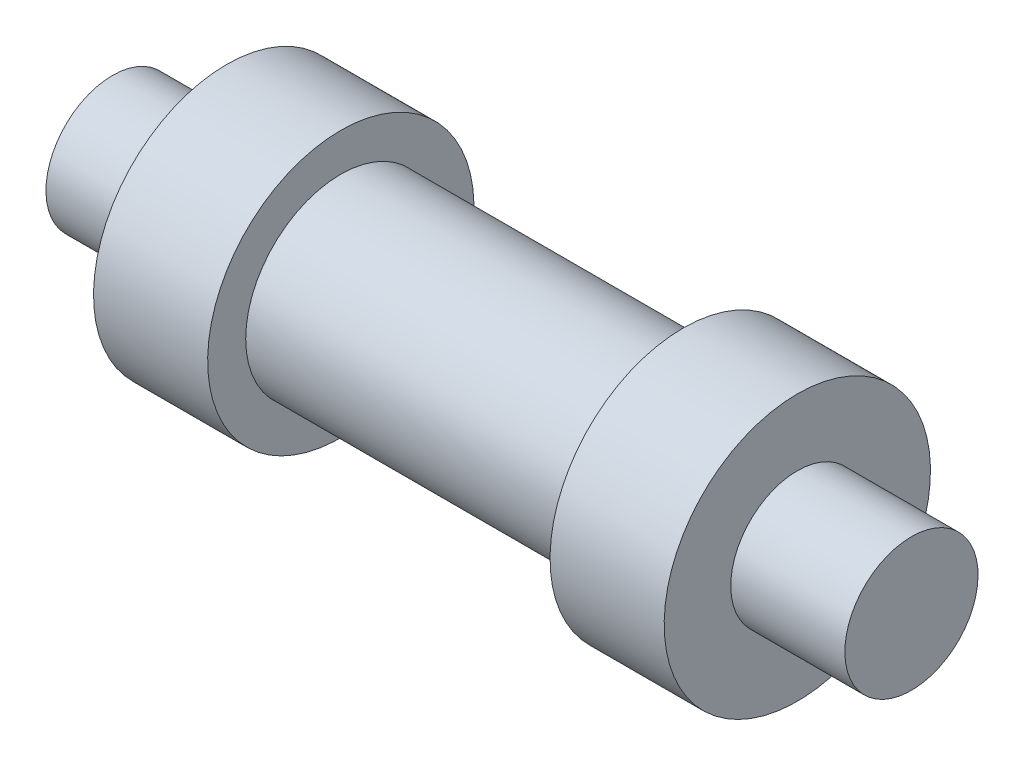
ISO-10303-21;
HEADER;
FILE_DESCRIPTION(('STEP AP214'),'2;1');
FILE_NAME('part.step','',(''),(''),'','','');
FILE_SCHEMA(('AUTOMOTIVE_DESIGN { 1 0 10303 214 1 1 1 1 }'));
ENDSEC;
DATA;
#1=APPLICATION_CONTEXT('core data for automotive mechanical design processes');
#2=APPLICATION_PROTOCOL_DEFINITION('international standard','automotive_design',2000,#1);
#3=PRODUCT_CONTEXT('',#1,'mechanical');
#4=PRODUCT('Part','Part','',(#3));
#5=PRODUCT_RELATED_PRODUCT_CATEGORY('part','',(#4));
#6=PRODUCT_DEFINITION_FORMATION('','',#4);
#7=PRODUCT_DEFINITION_CONTEXT('part definition',#1,'design');
#8=PRODUCT_DEFINITION('design','',#6,#7);
#9=PRODUCT_DEFINITION_SHAPE('','',#8);
#10=(LENGTH_UNIT() NAMED_UNIT(*) SI_UNIT(.MILLI.,.METRE.));
#11=(NAMED_UNIT(*) PLANE_ANGLE_UNIT() SI_UNIT($,.RADIAN.));
#12=(NAMED_UNIT(*) SI_UNIT($,.STERADIAN.) SOLID_ANGLE_UNIT());
#13=UNCERTAINTY_MEASURE_WITH_UNIT(LENGTH_MEASURE(1.E-05),#10,'distance_accuracy_value','');
#14=(GEOMETRIC_REPRESENTATION_CONTEXT(3) GLOBAL_UNCERTAINTY_ASSIGNED_CONTEXT((#13)) GLOBAL_UNIT_ASSIGNED_CONTEXT((#10,
#11,#12)) REPRESENTATION_CONTEXT('',''));
#15=CARTESIAN_POINT('',(0.,0.,0.));
#16=DIRECTION('',(0.,0.,1.));
#17=DIRECTION('',(1.,0.,0.));
#18=AXIS2_PLACEMENT_3D('',#15,#16,#17);
#19=CARTESIAN_POINT('',(0.,0.,0.));
#20=DIRECTION('',(-1.,0.,0.));
#21=DIRECTION('',(0.,-1.,0.));
#22=AXIS2_PLACEMENT_3D('',#19,#20,#21);
#23=PLANE('',#22);
#24=CARTESIAN_POINT('',(0.,0.,0.));
#25=DIRECTION('',(1.,0.,0.));
#26=DIRECTION('',(0.,1.,0.));
#27=AXIS2_PLACEMENT_3D('',#24,#25,#26);
#28=CIRCLE('',#27,3.5);
#29=CARTESIAN_POINT('',(0.,3.5,0.));
#30=VERTEX_POINT('',#29);
#31=EDGE_CURVE('E10',#30,#30,#28,.T.);
#32=ORIENTED_EDGE('',*,*,#31,.F.);
#33=EDGE_LOOP('',(#32));
#34=FACE_BOUND('',#33,.T.);
#35=ADVANCED_FACE('F37',(#34),#23,.T.);
#36=CARTESIAN_POINT('',(42.,0.,0.));
#37=DIRECTION('',(1.,0.,0.));
#38=DIRECTION('',(0.,1.,0.));
#39=AXIS2_PLACEMENT_3D('',#36,#37,#38);
#40=CYLINDRICAL_SURFACE('',#39,3.5);
#41=ORIENTED_EDGE('',*,*,#31,.T.);
#42=EDGE_LOOP('',(#41));
#43=FACE_BOUND('',#42,.T.);
#44=CARTESIAN_POINT('',(6.,0.,0.));
#45=DIRECTION('',(1.,0.,0.));
#46=DIRECTION('',(0.,1.,0.));
#47=AXIS2_PLACEMENT_3D('',#44,#45,#46);
#48=CIRCLE('',#47,3.5);
#49=CARTESIAN_POINT('',(6.,3.5,0.));
#50=VERTEX_POINT('',#49);
#51=EDGE_CURVE('E44',#50,#50,#48,.T.);
#52=ORIENTED_EDGE('',*,*,#51,.F.);
#53=EDGE_LOOP('',(#52));
#54=FACE_BOUND('',#53,.T.);
#55=ADVANCED_FACE('F101',(#43,#54),#40,.T.);
#56=CARTESIAN_POINT('',(6.,3.5,0.));
#57=DIRECTION('',(-1.,0.,0.));
#58=DIRECTION('',(0.,-1.,0.));
#59=AXIS2_PLACEMENT_3D('',#56,#57,#58);
#60=PLANE('',#59);
#61=ORIENTED_EDGE('',*,*,#51,.T.);
#62=EDGE_LOOP('',(#61));
#63=FACE_BOUND('',#62,.T.);
#64=CARTESIAN_POINT('',(6.,0.,0.));
#65=DIRECTION('',(1.,0.,0.));
#66=DIRECTION('',(0.,1.,0.));
#67=AXIS2_PLACEMENT_3D('',#64,#65,#66);
#68=CIRCLE('',#67,6.99999999999999);
#69=CARTESIAN_POINT('',(6.,6.99999999999999,0.));
#70=VERTEX_POINT('',#69);
#71=EDGE_CURVE('E49',#70,#70,#68,.T.);
#72=ORIENTED_EDGE('',*,*,#71,.F.);
#73=EDGE_LOOP('',(#72));
#74=FACE_BOUND('',#73,.T.);
#75=ADVANCED_FACE('F106',(#63,#74),#60,.T.);
#76=CARTESIAN_POINT('',(42.,0.,0.));
#77=DIRECTION('',(1.,0.,0.));
#78=DIRECTION('',(0.,1.,0.));
#79=AXIS2_PLACEMENT_3D('',#76,#77,#78);
#80=CYLINDRICAL_SURFACE('',#79,6.99999999999999);
#81=ORIENTED_EDGE('',*,*,#71,.T.);
#82=EDGE_LOOP('',(#81));
#83=FACE_BOUND('',#82,.T.);
#84=CARTESIAN_POINT('',(12.,0.,0.));
#85=DIRECTION('',(1.,0.,0.));
#86=DIRECTION('',(0.,1.,0.));
#87=AXIS2_PLACEMENT_3D('',#84,#85,#86);
#88=CIRCLE('',#87,6.99999999999999);
#89=CARTESIAN_POINT('',(12.,6.99999999999999,0.));
#90=VERTEX_POINT('',#89);
#91=EDGE_CURVE('E54',#90,#90,#88,.T.);
#92=ORIENTED_EDGE('',*,*,#91,.F.);
#93=EDGE_LOOP('',(#92));
#94=FACE_BOUND('',#93,.T.);
#95=ADVANCED_FACE('F110',(#83,#94),#80,.T.);
#96=CARTESIAN_POINT('',(12.,6.99999999999999,0.));
#97=DIRECTION('',(1.,0.,0.));
#98=DIRECTION('',(0.,1.,0.));
#99=AXIS2_PLACEMENT_3D('',#96,#97,#98);
#100=PLANE('',#99);
#101=ORIENTED_EDGE('',*,*,#91,.T.);
#102=EDGE_LOOP('',(#101));
#103=FACE_BOUND('',#102,.T.);
#104=CARTESIAN_POINT('',(12.,0.,0.));
#105=DIRECTION('',(1.,0.,0.));
#106=DIRECTION('',(0.,1.,0.));
#107=AXIS2_PLACEMENT_3D('',#104,#105,#106);
#108=CIRCLE('',#107,5.);
#109=CARTESIAN_POINT('',(12.,5.,0.));
#110=VERTEX_POINT('',#109);
#111=EDGE_CURVE('E60',#110,#110,#108,.T.);
#112=ORIENTED_EDGE('',*,*,#111,.F.);
#113=EDGE_LOOP('',(#112));
#114=FACE_BOUND('',#113,.T.);
#115=ADVANCED_FACE('F116',(#103,#114),#100,.T.);
#116=CARTESIAN_POINT('',(42.,0.,0.));
#117=DIRECTION('',(1.,0.,0.));
#118=DIRECTION('',(0.,1.,0.));
#119=AXIS2_PLACEMENT_3D('',#116,#117,#118);
#120=CYLINDRICAL_SURFACE('',#119,5.);
#121=ORIENTED_EDGE('',*,*,#111,.T.);
#122=EDGE_LOOP('',(#121));
#123=FACE_BOUND('',#122,.T.);
#124=CARTESIAN_POINT('',(30.,0.,0.));
#125=DIRECTION('',(1.,0.,0.));
#126=DIRECTION('',(0.,1.,0.));
#127=AXIS2_PLACEMENT_3D('',#124,#125,#126);
#128=CIRCLE('',#127,5.);
#129=CARTESIAN_POINT('',(30.,5.,0.));
#130=VERTEX_POINT('',#129);
#131=EDGE_CURVE('E64',#130,#130,#128,.T.);
#132=ORIENTED_EDGE('',*,*,#131,.F.);
#133=EDGE_LOOP('',(#132));
#134=FACE_BOUND('',#133,.T.);
#135=ADVANCED_FACE('F120',(#123,#134),#120,.T.);
#136=CARTESIAN_POINT('',(30.,5.,0.));
#137=DIRECTION('',(-1.,0.,0.));
#138=DIRECTION('',(0.,-1.,0.));
#139=AXIS2_PLACEMENT_3D('',#136,#137,#138);
#140=PLANE('',#139);
#141=ORIENTED_EDGE('',*,*,#131,.T.);
#142=EDGE_LOOP('',(#141));
#143=FACE_BOUND('',#142,.T.);
#144=CARTESIAN_POINT('',(30.,0.,0.));
#145=DIRECTION('',(1.,0.,0.));
#146=DIRECTION('',(0.,1.,0.));
#147=AXIS2_PLACEMENT_3D('',#144,#145,#146);
#148=CIRCLE('',#147,7.);
#149=CARTESIAN_POINT('',(30.,7.,0.));
#150=VERTEX_POINT('',#149);
#151=EDGE_CURVE('E68',#150,#150,#148,.T.);
#152=ORIENTED_EDGE('',*,*,#151,.F.);
#153=EDGE_LOOP('',(#152));
#154=FACE_BOUND('',#153,.T.);
#155=ADVANCED_FACE('F124',(#143,#154),#140,.T.);
#156=CARTESIAN_POINT('',(42.,0.,0.));
#157=DIRECTION('',(1.,0.,0.));
#158=DIRECTION('',(0.,1.,0.));
#159=AXIS2_PLACEMENT_3D('',#156,#157,#158);
#160=CYLINDRICAL_SURFACE('',#159,7.);
#161=ORIENTED_EDGE('',*,*,#151,.T.);
#162=EDGE_LOOP('',(#161));
#163=FACE_BOUND('',#162,.T.);
#164=CARTESIAN_POINT('',(36.,0.,0.));
#165=DIRECTION('',(1.,0.,0.));
#166=DIRECTION('',(0.,1.,0.));
#167=AXIS2_PLACEMENT_3D('',#164,#165,#166);
#168=CIRCLE('',#167,7.);
#169=CARTESIAN_POINT('',(36.,7.,0.));
#170=VERTEX_POINT('',#169);
#171=EDGE_CURVE('E72',#170,#170,#168,.T.);
#172=ORIENTED_EDGE('',*,*,#171,.F.);
#173=EDGE_LOOP('',(#172));
#174=FACE_BOUND('',#173,.T.);
#175=ADVANCED_FACE('F97',(#163,#174),#160,.T.);
#176=CARTESIAN_POINT('',(36.,7.,0.));
#177=DIRECTION('',(1.,0.,0.));
#178=DIRECTION('',(0.,1.,0.));
#179=AXIS2_PLACEMENT_3D('',#176,#177,#178);
#180=PLANE('',#179);
#181=ORIENTED_EDGE('',*,*,#171,.T.);
#182=EDGE_LOOP('',(#181));
#183=FACE_BOUND('',#182,.T.);
#184=CARTESIAN_POINT('',(36.,0.,0.));
#185=DIRECTION('',(1.,0.,0.));
#186=DIRECTION('',(0.,1.,0.));
#187=AXIS2_PLACEMENT_3D('',#184,#185,#186);
#188=CIRCLE('',#187,3.5);
#189=CARTESIAN_POINT('',(36.,3.5,0.));
#190=VERTEX_POINT('',#189);
#191=EDGE_CURVE('E76',#190,#190,#188,.T.);
#192=ORIENTED_EDGE('',*,*,#191,.F.);
#193=EDGE_LOOP('',(#192));
#194=FACE_BOUND('',#193,.T.);
#195=ADVANCED_FACE('F89',(#183,#194),#180,.T.);
#196=CARTESIAN_POINT('',(42.,0.,0.));
#197=DIRECTION('',(1.,0.,0.));
#198=DIRECTION('',(0.,1.,0.));
#199=AXIS2_PLACEMENT_3D('',#196,#197,#198);
#200=CYLINDRICAL_SURFACE('',#199,3.5);
#201=ORIENTED_EDGE('',*,*,#191,.T.);
#202=EDGE_LOOP('',(#201));
#203=FACE_BOUND('',#202,.T.);
#204=CARTESIAN_POINT('',(42.,0.,0.));
#205=DIRECTION('',(1.,0.,0.));
#206=DIRECTION('',(0.,1.,0.));
#207=AXIS2_PLACEMENT_3D('',#204,#205,#206);
#208=CIRCLE('',#207,3.5);
#209=CARTESIAN_POINT('',(42.,3.5,0.));
#210=VERTEX_POINT('',#209);
#211=EDGE_CURVE('E80',#210,#210,#208,.T.);
#212=ORIENTED_EDGE('',*,*,#211,.F.);
#213=EDGE_LOOP('',(#212));
#214=FACE_BOUND('',#213,.T.);
#215=ADVANCED_FACE('F87',(#203,#214),#200,.T.);
#216=CARTESIAN_POINT('',(42.,3.5,0.));
#217=DIRECTION('',(1.,0.,0.));
#218=DIRECTION('',(0.,1.,0.));
#219=AXIS2_PLACEMENT_3D('',#216,#217,#218);
#220=PLANE('',#219);
#221=ORIENTED_EDGE('',*,*,#211,.T.);
#222=EDGE_LOOP('',(#221));
#223=FACE_BOUND('',#222,.T.);
#224=ADVANCED_FACE('F85',(#223),#220,.T.);
#225=CLOSED_SHELL('',(#35,#55,#75,#95,#115,#135,#155,#175,#195,#215,#224));
#226=MANIFOLD_SOLID_BREP('B2',#225);
#227=ADVANCED_BREP_SHAPE_REPRESENTATION('',(#18,#226),#14);
#228=SHAPE_DEFINITION_REPRESENTATION(#9,#227);
ENDSEC;
END-ISO-10303-21;
